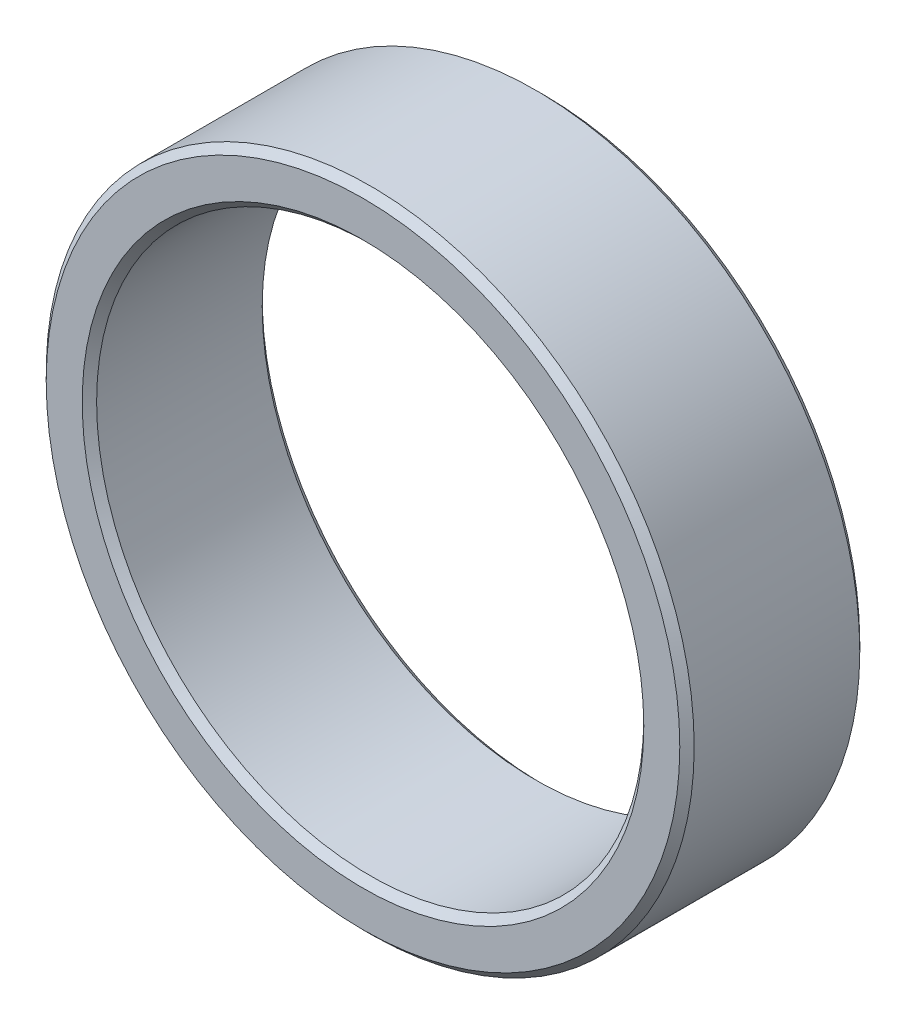
ISO-10303-21;
HEADER;
FILE_DESCRIPTION(('STEP AP214'),'2;1');
FILE_NAME('part.step','',(''),(''),'','','');
FILE_SCHEMA(('AUTOMOTIVE_DESIGN { 1 0 10303 214 1 1 1 1 }'));
ENDSEC;
DATA;
#1=APPLICATION_CONTEXT('core data for automotive mechanical design processes');
#2=APPLICATION_PROTOCOL_DEFINITION('international standard','automotive_design',2000,#1);
#3=PRODUCT_CONTEXT('',#1,'mechanical');
#4=PRODUCT('Part','Part','',(#3));
#5=PRODUCT_RELATED_PRODUCT_CATEGORY('part','',(#4));
#6=PRODUCT_DEFINITION_FORMATION('','',#4);
#7=PRODUCT_DEFINITION_CONTEXT('part definition',#1,'design');
#8=PRODUCT_DEFINITION('design','',#6,#7);
#9=PRODUCT_DEFINITION_SHAPE('','',#8);
#10=(LENGTH_UNIT() NAMED_UNIT(*) SI_UNIT(.MILLI.,.METRE.));
#11=(NAMED_UNIT(*) PLANE_ANGLE_UNIT() SI_UNIT($,.RADIAN.));
#12=(NAMED_UNIT(*) SI_UNIT($,.STERADIAN.) SOLID_ANGLE_UNIT());
#13=UNCERTAINTY_MEASURE_WITH_UNIT(LENGTH_MEASURE(1.E-05),#10,'distance_accuracy_value','');
#14=(GEOMETRIC_REPRESENTATION_CONTEXT(3) GLOBAL_UNCERTAINTY_ASSIGNED_CONTEXT((#13)) GLOBAL_UNIT_ASSIGNED_CONTEXT((#10,
#11,#12)) REPRESENTATION_CONTEXT('',''));
#15=CARTESIAN_POINT('',(0.,0.,0.));
#16=DIRECTION('',(0.,0.,1.));
#17=DIRECTION('',(1.,0.,0.));
#18=AXIS2_PLACEMENT_3D('',#15,#16,#17);
#19=CARTESIAN_POINT('',(0.,0.,5.));
#20=DIRECTION('',(0.,0.,1.));
#21=DIRECTION('',(1.,0.,0.));
#22=AXIS2_PLACEMENT_3D('',#19,#20,#21);
#23=PLANE('',#22);
#24=CARTESIAN_POINT('',(0.,0.,5.));
#25=DIRECTION('',(0.,0.,1.));
#26=DIRECTION('',(1.,0.,0.));
#27=AXIS2_PLACEMENT_3D('',#24,#25,#26);
#28=CIRCLE('',#27,8.8);
#29=CARTESIAN_POINT('',(8.8,0.,5.));
#30=VERTEX_POINT('',#29);
#31=EDGE_CURVE('E10',#30,#30,#28,.T.);
#32=ORIENTED_EDGE('',*,*,#31,.T.);
#33=EDGE_LOOP('',(#32));
#34=FACE_BOUND('',#33,.T.);
#35=CARTESIAN_POINT('',(0.,0.,5.));
#36=DIRECTION('',(0.,0.,1.));
#37=DIRECTION('',(1.,0.,0.));
#38=AXIS2_PLACEMENT_3D('',#35,#36,#37);
#39=CIRCLE('',#38,7.79999999999999);
#40=CARTESIAN_POINT('',(7.79999999999999,0.,5.));
#41=VERTEX_POINT('',#40);
#42=EDGE_CURVE('E58',#41,#41,#39,.F.);
#43=ORIENTED_EDGE('',*,*,#42,.T.);
#44=EDGE_LOOP('',(#43));
#45=FACE_BOUND('',#44,.T.);
#46=ADVANCED_FACE('F49',(#34,#45),#23,.T.);
#47=CARTESIAN_POINT('',(0.,0.,0.));
#48=DIRECTION('',(0.,0.,1.));
#49=DIRECTION('',(1.,0.,0.));
#50=AXIS2_PLACEMENT_3D('',#47,#48,#49);
#51=PLANE('',#50);
#52=CARTESIAN_POINT('',(0.,0.,0.));
#53=DIRECTION('',(0.,0.,1.));
#54=DIRECTION('',(1.,0.,0.));
#55=AXIS2_PLACEMENT_3D('',#52,#53,#54);
#56=CIRCLE('',#55,7.8);
#57=CARTESIAN_POINT('',(7.8,0.,0.));
#58=VERTEX_POINT('',#57);
#59=EDGE_CURVE('E82',#58,#58,#56,.T.);
#60=ORIENTED_EDGE('',*,*,#59,.T.);
#61=EDGE_LOOP('',(#60));
#62=FACE_BOUND('',#61,.T.);
#63=CARTESIAN_POINT('',(0.,0.,0.));
#64=DIRECTION('',(0.,0.,1.));
#65=DIRECTION('',(1.,0.,0.));
#66=AXIS2_PLACEMENT_3D('',#63,#64,#65);
#67=CIRCLE('',#66,8.8);
#68=CARTESIAN_POINT('',(8.8,0.,0.));
#69=VERTEX_POINT('',#68);
#70=EDGE_CURVE('E86',#69,#69,#67,.F.);
#71=ORIENTED_EDGE('',*,*,#70,.T.);
#72=EDGE_LOOP('',(#71));
#73=FACE_BOUND('',#72,.T.);
#74=ADVANCED_FACE('F91',(#62,#73),#51,.F.);
#75=CARTESIAN_POINT('',(0.,0.,5.));
#76=DIRECTION('',(0.,0.,-1.));
#77=DIRECTION('',(-1.,0.,0.));
#78=AXIS2_PLACEMENT_3D('',#75,#76,#77);
#79=CYLINDRICAL_SURFACE('',#78,9.);
#80=CARTESIAN_POINT('',(0.,0.,0.200000000000001));
#81=DIRECTION('',(0.,0.,1.));
#82=DIRECTION('',(1.,0.,0.));
#83=AXIS2_PLACEMENT_3D('',#80,#81,#82);
#84=CIRCLE('',#83,9.);
#85=CARTESIAN_POINT('',(9.,0.,0.200000000000001));
#86=VERTEX_POINT('',#85);
#87=EDGE_CURVE('E63',#86,#86,#84,.T.);
#88=ORIENTED_EDGE('',*,*,#87,.T.);
#89=EDGE_LOOP('',(#88));
#90=FACE_BOUND('',#89,.T.);
#91=CARTESIAN_POINT('',(0.,0.,4.8));
#92=DIRECTION('',(0.,0.,1.));
#93=DIRECTION('',(1.,0.,0.));
#94=AXIS2_PLACEMENT_3D('',#91,#92,#93);
#95=CIRCLE('',#94,9.);
#96=CARTESIAN_POINT('',(9.,0.,4.8));
#97=VERTEX_POINT('',#96);
#98=EDGE_CURVE('E68',#97,#97,#95,.F.);
#99=ORIENTED_EDGE('',*,*,#98,.T.);
#100=EDGE_LOOP('',(#99));
#101=FACE_BOUND('',#100,.T.);
#102=ADVANCED_FACE('F101',(#90,#101),#79,.T.);
#103=CARTESIAN_POINT('',(0.,0.,5.));
#104=DIRECTION('',(0.,0.,-1.));
#105=DIRECTION('',(-1.,0.,0.));
#106=AXIS2_PLACEMENT_3D('',#103,#104,#105);
#107=CYLINDRICAL_SURFACE('',#106,7.6);
#108=CARTESIAN_POINT('',(0.,0.,0.199999999999999));
#109=DIRECTION('',(0.,0.,1.));
#110=DIRECTION('',(1.,0.,0.));
#111=AXIS2_PLACEMENT_3D('',#108,#109,#110);
#112=CIRCLE('',#111,7.6);
#113=CARTESIAN_POINT('',(7.6,0.,0.199999999999999));
#114=VERTEX_POINT('',#113);
#115=EDGE_CURVE('E74',#114,#114,#112,.F.);
#116=ORIENTED_EDGE('',*,*,#115,.T.);
#117=EDGE_LOOP('',(#116));
#118=FACE_BOUND('',#117,.T.);
#119=CARTESIAN_POINT('',(0.,0.,4.80000000000001));
#120=DIRECTION('',(0.,0.,1.));
#121=DIRECTION('',(1.,0.,0.));
#122=AXIS2_PLACEMENT_3D('',#119,#120,#121);
#123=CIRCLE('',#122,7.6);
#124=CARTESIAN_POINT('',(7.6,0.,4.80000000000001));
#125=VERTEX_POINT('',#124);
#126=EDGE_CURVE('E78',#125,#125,#123,.T.);
#127=ORIENTED_EDGE('',*,*,#126,.T.);
#128=EDGE_LOOP('',(#127));
#129=FACE_BOUND('',#128,.T.);
#130=ADVANCED_FACE('F104',(#118,#129),#107,.F.);
#131=CARTESIAN_POINT('',(0.,0.,0.));
#132=DIRECTION('',(0.,0.,-1.));
#133=DIRECTION('',(-1.,0.,0.));
#134=AXIS2_PLACEMENT_3D('',#131,#132,#133);
#135=CONICAL_SURFACE('',#134,7.8,0.785398163397448);
#136=ORIENTED_EDGE('',*,*,#115,.F.);
#137=EDGE_LOOP('',(#136));
#138=FACE_BOUND('',#137,.T.);
#139=ORIENTED_EDGE('',*,*,#59,.F.);
#140=EDGE_LOOP('',(#139));
#141=FACE_BOUND('',#140,.T.);
#142=ADVANCED_FACE('F97',(#138,#141),#135,.F.);
#143=CARTESIAN_POINT('',(0.,0.,0.200000000000001));
#144=DIRECTION('',(0.,0.,1.));
#145=DIRECTION('',(1.,0.,0.));
#146=AXIS2_PLACEMENT_3D('',#143,#144,#145);
#147=CONICAL_SURFACE('',#146,9.,0.785398163397453);
#148=ORIENTED_EDGE('',*,*,#70,.F.);
#149=EDGE_LOOP('',(#148));
#150=FACE_BOUND('',#149,.T.);
#151=ORIENTED_EDGE('',*,*,#87,.F.);
#152=EDGE_LOOP('',(#151));
#153=FACE_BOUND('',#152,.T.);
#154=ADVANCED_FACE('F93',(#150,#153),#147,.T.);
#155=CARTESIAN_POINT('',(0.,0.,5.));
#156=DIRECTION('',(0.,0.,-1.));
#157=DIRECTION('',(-1.,0.,0.));
#158=AXIS2_PLACEMENT_3D('',#155,#156,#157);
#159=CONICAL_SURFACE('',#158,8.8,0.785398163397457);
#160=ORIENTED_EDGE('',*,*,#98,.F.);
#161=EDGE_LOOP('',(#160));
#162=FACE_BOUND('',#161,.T.);
#163=ORIENTED_EDGE('',*,*,#31,.F.);
#164=EDGE_LOOP('',(#163));
#165=FACE_BOUND('',#164,.T.);
#166=ADVANCED_FACE('F96',(#162,#165),#159,.T.);
#167=CARTESIAN_POINT('',(0.,0.,4.80000000000001));
#168=DIRECTION('',(0.,0.,1.));
#169=DIRECTION('',(1.,0.,0.));
#170=AXIS2_PLACEMENT_3D('',#167,#168,#169);
#171=CONICAL_SURFACE('',#170,7.6,0.785398163397446);
#172=CARTESIAN_POINT('',(7.79999999999999,0.,5.));
#173=CARTESIAN_POINT('',(7.79791666666666,0.,4.99791666666667));
#174=CARTESIAN_POINT('',(7.79583333333333,0.,4.99583333333333));
#175=CARTESIAN_POINT('',(7.79166666666666,0.,4.99166666666667));
#176=CARTESIAN_POINT('',(7.78958333333333,0.,4.98958333333333));
#177=CARTESIAN_POINT('',(7.78541666666666,0.,4.98541666666667));
#178=CARTESIAN_POINT('',(7.78333333333333,0.,4.98333333333333));
#179=CARTESIAN_POINT('',(7.77916666666666,0.,4.97916666666667));
#180=CARTESIAN_POINT('',(7.77708333333333,0.,4.97708333333333));
#181=CARTESIAN_POINT('',(7.77291666666666,0.,4.97291666666667));
#182=CARTESIAN_POINT('',(7.77083333333333,0.,4.97083333333333));
#183=CARTESIAN_POINT('',(7.76666666666666,0.,4.96666666666667));
#184=CARTESIAN_POINT('',(7.76458333333333,0.,4.96458333333333));
#185=CARTESIAN_POINT('',(7.76041666666666,0.,4.96041666666667));
#186=CARTESIAN_POINT('',(7.75833333333333,0.,4.95833333333333));
#187=CARTESIAN_POINT('',(7.75416666666666,0.,4.95416666666667));
#188=CARTESIAN_POINT('',(7.75208333333333,0.,4.95208333333333));
#189=CARTESIAN_POINT('',(7.74791666666666,0.,4.94791666666667));
#190=CARTESIAN_POINT('',(7.74583333333333,0.,4.94583333333333));
#191=CARTESIAN_POINT('',(7.74166666666666,0.,4.94166666666667));
#192=CARTESIAN_POINT('',(7.73958333333333,0.,4.93958333333333));
#193=CARTESIAN_POINT('',(7.73541666666666,0.,4.93541666666667));
#194=CARTESIAN_POINT('',(7.73333333333333,0.,4.93333333333334));
#195=CARTESIAN_POINT('',(7.72916666666666,0.,4.92916666666667));
#196=CARTESIAN_POINT('',(7.72708333333333,0.,4.92708333333333));
#197=CARTESIAN_POINT('',(7.72291666666666,0.,4.92291666666667));
#198=CARTESIAN_POINT('',(7.72083333333333,0.,4.92083333333334));
#199=CARTESIAN_POINT('',(7.71666666666666,0.,4.91666666666667));
#200=CARTESIAN_POINT('',(7.71458333333333,0.,4.91458333333333));
#201=CARTESIAN_POINT('',(7.71041666666666,0.,4.91041666666667));
#202=CARTESIAN_POINT('',(7.70833333333333,0.,4.90833333333334));
#203=CARTESIAN_POINT('',(7.70416666666666,0.,4.90416666666667));
#204=CARTESIAN_POINT('',(7.70208333333333,0.,4.90208333333334));
#205=CARTESIAN_POINT('',(7.69791666666666,0.,4.89791666666667));
#206=CARTESIAN_POINT('',(7.69583333333333,0.,4.89583333333334));
#207=CARTESIAN_POINT('',(7.69166666666666,0.,4.89166666666667));
#208=CARTESIAN_POINT('',(7.68958333333333,0.,4.88958333333334));
#209=CARTESIAN_POINT('',(7.68541666666666,0.,4.88541666666667));
#210=CARTESIAN_POINT('',(7.68333333333333,0.,4.88333333333334));
#211=CARTESIAN_POINT('',(7.67916666666666,0.,4.87916666666667));
#212=CARTESIAN_POINT('',(7.67708333333333,0.,4.87708333333334));
#213=CARTESIAN_POINT('',(7.67291666666666,0.,4.87291666666667));
#214=CARTESIAN_POINT('',(7.67083333333333,0.,4.87083333333334));
#215=CARTESIAN_POINT('',(7.66666666666666,0.,4.86666666666667));
#216=CARTESIAN_POINT('',(7.66458333333333,0.,4.86458333333334));
#217=CARTESIAN_POINT('',(7.66041666666666,0.,4.86041666666667));
#218=CARTESIAN_POINT('',(7.65833333333333,0.,4.85833333333334));
#219=CARTESIAN_POINT('',(7.65416666666667,0.,4.85416666666667));
#220=CARTESIAN_POINT('',(7.65208333333333,0.,4.85208333333334));
#221=CARTESIAN_POINT('',(7.64791666666666,0.,4.84791666666667));
#222=CARTESIAN_POINT('',(7.64583333333333,0.,4.84583333333334));
#223=CARTESIAN_POINT('',(7.64166666666666,0.,4.84166666666667));
#224=CARTESIAN_POINT('',(7.63958333333333,0.,4.83958333333334));
#225=CARTESIAN_POINT('',(7.63541666666667,0.,4.83541666666667));
#226=CARTESIAN_POINT('',(7.63333333333333,0.,4.83333333333334));
#227=CARTESIAN_POINT('',(7.62916666666667,0.,4.82916666666667));
#228=CARTESIAN_POINT('',(7.62708333333333,0.,4.82708333333334));
#229=CARTESIAN_POINT('',(7.62291666666667,0.,4.82291666666667));
#230=CARTESIAN_POINT('',(7.62083333333333,0.,4.82083333333334));
#231=CARTESIAN_POINT('',(7.61666666666667,0.,4.81666666666667));
#232=CARTESIAN_POINT('',(7.61458333333333,0.,4.81458333333334));
#233=CARTESIAN_POINT('',(7.61041666666667,0.,4.81041666666667));
#234=CARTESIAN_POINT('',(7.60833333333333,0.,4.80833333333334));
#235=CARTESIAN_POINT('',(7.60416666666667,0.,4.80416666666667));
#236=CARTESIAN_POINT('',(7.60208333333333,0.,4.80208333333334));
#237=CARTESIAN_POINT('',(7.6,0.,4.80000000000001));
#238=B_SPLINE_CURVE_WITH_KNOTS('',3,(#172,#173,#174,#175,#176,#177,#178,#179,#180,#181,#182,
#183,#184,#185,#186,#187,#188,#189,#190,#191,#192,#193,#194,#195,#196,#197,#198,#199,#200,#201,
#202,#203,#204,#205,#206,#207,#208,#209,#210,#211,#212,#213,#214,#215,#216,#217,#218,#219,#220,
#221,#222,#223,#224,#225,#226,#227,#228,#229,#230,#231,#232,#233,#234,#235,#236,#237),
.UNSPECIFIED.,.F.,.F.,(4,2,2,2,2,2,2,2,2,2,2,2,2,2,2,2,2,2,2,2,2,2,2,2,2,2,2,2,2,2,2,2,4),(0.,
0.0088388347648321,0.0176776695296642,0.0265165042944951,0.0353553390593272,0.044194173824158,
0.0530330085889901,0.0618718433538216,0.0707106781186531,0.0795495128834846,0.088388347648316,
0.0972271824131481,0.10606601717798,0.114904851942811,0.123743686707643,0.132582521472474,
0.141421356237306,0.150260191002138,0.159099025766969,0.167937860531801,0.176776695296632,
0.185615530061464,0.194454364826296,0.203293199591127,0.212132034355959,0.22097086912079,
0.229809703885622,0.238648538650454,0.247487373415285,0.256326208180117,0.265165042944947,
0.27400387770978,0.28284271247461),.UNSPECIFIED.);
#239=EDGE_CURVE('BSEAM52',#41,#125,#238,.T.);
#240=ORIENTED_EDGE('',*,*,#42,.F.);
#241=ORIENTED_EDGE('',*,*,#126,.F.);
#242=ORIENTED_EDGE('',*,*,#239,.T.);
#243=ORIENTED_EDGE('',*,*,#239,.F.);
#244=EDGE_LOOP('',(#240,#242,#241,#243));
#245=FACE_BOUND('',#244,.T.);
#246=ADVANCED_FACE('F52',(#245),#171,.F.);
#247=CLOSED_SHELL('',(#46,#74,#102,#130,#142,#154,#166,#246));
#248=MANIFOLD_SOLID_BREP('B2',#247);
#249=ADVANCED_BREP_SHAPE_REPRESENTATION('',(#18,#248),#14);
#250=SHAPE_DEFINITION_REPRESENTATION(#9,#249);
ENDSEC;
END-ISO-10303-21;
